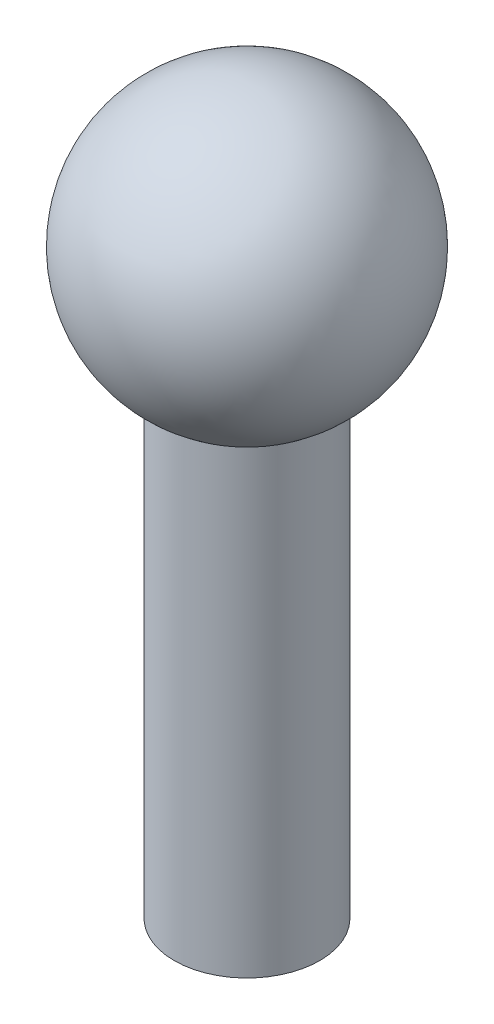
ISO-10303-21;
HEADER;
FILE_DESCRIPTION(('STEP AP214'),'2;1');
FILE_NAME('part.step','',(''),(''),'','','');
FILE_SCHEMA(('AUTOMOTIVE_DESIGN { 1 0 10303 214 1 1 1 1 }'));
ENDSEC;
DATA;
#1=APPLICATION_CONTEXT('core data for automotive mechanical design processes');
#2=APPLICATION_PROTOCOL_DEFINITION('international standard','automotive_design',2000,#1);
#3=PRODUCT_CONTEXT('',#1,'mechanical');
#4=PRODUCT('Part','Part','',(#3));
#5=PRODUCT_RELATED_PRODUCT_CATEGORY('part','',(#4));
#6=PRODUCT_DEFINITION_FORMATION('','',#4);
#7=PRODUCT_DEFINITION_CONTEXT('part definition',#1,'design');
#8=PRODUCT_DEFINITION('design','',#6,#7);
#9=PRODUCT_DEFINITION_SHAPE('','',#8);
#10=(LENGTH_UNIT() NAMED_UNIT(*) SI_UNIT(.MILLI.,.METRE.));
#11=(NAMED_UNIT(*) PLANE_ANGLE_UNIT() SI_UNIT($,.RADIAN.));
#12=(NAMED_UNIT(*) SI_UNIT($,.STERADIAN.) SOLID_ANGLE_UNIT());
#13=UNCERTAINTY_MEASURE_WITH_UNIT(LENGTH_MEASURE(1.E-05),#10,'distance_accuracy_value','');
#14=(GEOMETRIC_REPRESENTATION_CONTEXT(3) GLOBAL_UNCERTAINTY_ASSIGNED_CONTEXT((#13)) GLOBAL_UNIT_ASSIGNED_CONTEXT((#10,
#11,#12)) REPRESENTATION_CONTEXT('',''));
#15=CARTESIAN_POINT('',(0.,0.,0.));
#16=DIRECTION('',(0.,0.,1.));
#17=DIRECTION('',(1.,0.,0.));
#18=AXIS2_PLACEMENT_3D('',#15,#16,#17);
#19=CARTESIAN_POINT('',(0.,16.,0.));
#20=DIRECTION('',(0.,1.,0.));
#21=DIRECTION('',(1.,0.,0.));
#22=AXIS2_PLACEMENT_3D('',#19,#20,#21);
#23=SPHERICAL_SURFACE('',#22,3.9);
#24=CARTESIAN_POINT('',(0.,12.6518661914434,0.));
#25=DIRECTION('',(0.,1.,0.));
#26=DIRECTION('',(0.,0.,1.));
#27=AXIS2_PLACEMENT_3D('',#24,#25,#26);
#28=CIRCLE('',#27,2.);
#29=CARTESIAN_POINT('',(0.,12.6518661914434,2.));
#30=VERTEX_POINT('',#29);
#31=EDGE_CURVE('E10',#30,#30,#28,.T.);
#32=ORIENTED_EDGE('',*,*,#31,.T.);
#33=EDGE_LOOP('',(#32));
#34=FACE_BOUND('',#33,.T.);
#35=ADVANCED_FACE('F45',(#34),#23,.T.);
#36=CARTESIAN_POINT('',(0.,19.9,0.));
#37=DIRECTION('',(0.,1.,0.));
#38=DIRECTION('',(0.,0.,1.));
#39=AXIS2_PLACEMENT_3D('',#36,#37,#38);
#40=CYLINDRICAL_SURFACE('',#39,2.);
#41=ORIENTED_EDGE('',*,*,#31,.F.);
#42=EDGE_LOOP('',(#41));
#43=FACE_BOUND('',#42,.T.);
#44=CARTESIAN_POINT('',(0.,0.,0.));
#45=DIRECTION('',(0.,1.,0.));
#46=DIRECTION('',(0.,0.,1.));
#47=AXIS2_PLACEMENT_3D('',#44,#45,#46);
#48=CIRCLE('',#47,2.);
#49=CARTESIAN_POINT('',(0.,0.,2.));
#50=VERTEX_POINT('',#49);
#51=EDGE_CURVE('E52',#50,#50,#48,.T.);
#52=ORIENTED_EDGE('',*,*,#51,.T.);
#53=EDGE_LOOP('',(#52));
#54=FACE_BOUND('',#53,.T.);
#55=ADVANCED_FACE('F59',(#43,#54),#40,.T.);
#56=CARTESIAN_POINT('',(0.,0.,0.));
#57=DIRECTION('',(0.,1.,0.));
#58=DIRECTION('',(0.,0.,1.));
#59=AXIS2_PLACEMENT_3D('',#56,#57,#58);
#60=PLANE('',#59);
#61=ORIENTED_EDGE('',*,*,#51,.F.);
#62=EDGE_LOOP('',(#61));
#63=FACE_BOUND('',#62,.T.);
#64=ADVANCED_FACE('F61',(#63),#60,.F.);
#65=CLOSED_SHELL('',(#35,#55,#64));
#66=MANIFOLD_SOLID_BREP('B2',#65);
#67=ADVANCED_BREP_SHAPE_REPRESENTATION('',(#18,#66),#14);
#68=SHAPE_DEFINITION_REPRESENTATION(#9,#67);
ENDSEC;
END-ISO-10303-21;
